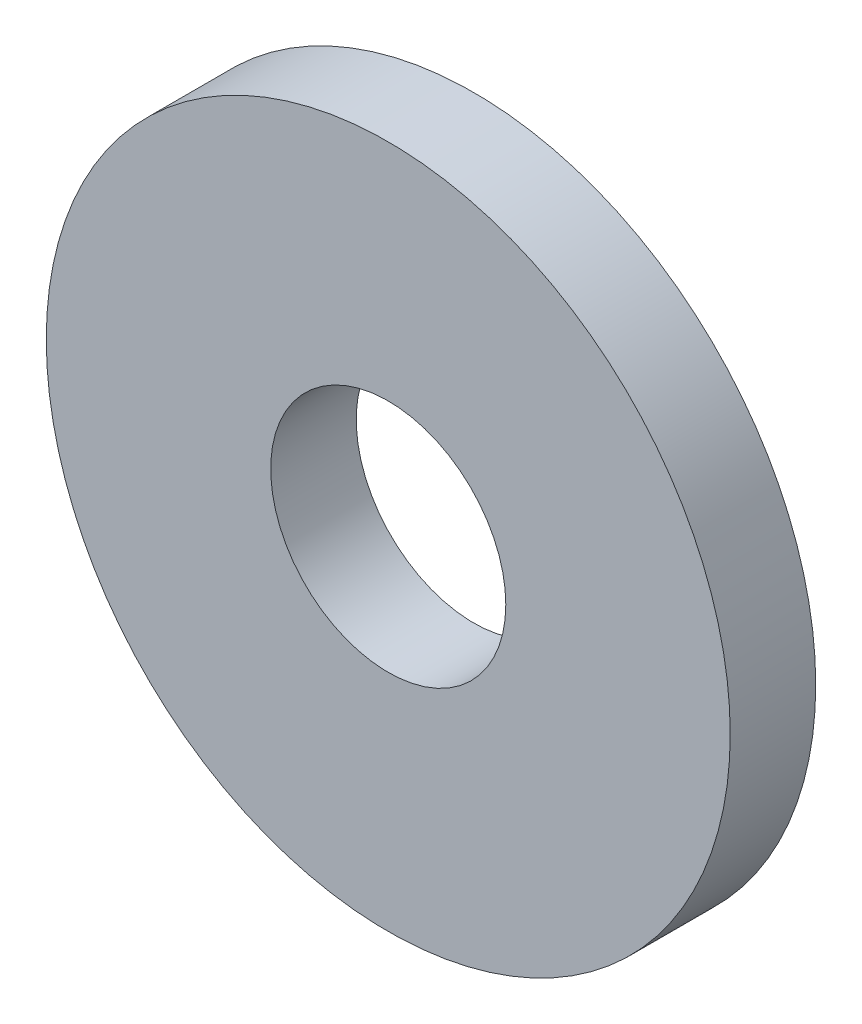
ISO-10303-21;
HEADER;
FILE_DESCRIPTION(('STEP AP214'),'2;1');
FILE_NAME('part.step','',(''),(''),'','','');
FILE_SCHEMA(('AUTOMOTIVE_DESIGN { 1 0 10303 214 1 1 1 1 }'));
ENDSEC;
DATA;
#1=APPLICATION_CONTEXT('core data for automotive mechanical design processes');
#2=APPLICATION_PROTOCOL_DEFINITION('international standard','automotive_design',2000,#1);
#3=PRODUCT_CONTEXT('',#1,'mechanical');
#4=PRODUCT('Part','Part','',(#3));
#5=PRODUCT_RELATED_PRODUCT_CATEGORY('part','',(#4));
#6=PRODUCT_DEFINITION_FORMATION('','',#4);
#7=PRODUCT_DEFINITION_CONTEXT('part definition',#1,'design');
#8=PRODUCT_DEFINITION('design','',#6,#7);
#9=PRODUCT_DEFINITION_SHAPE('','',#8);
#10=(LENGTH_UNIT() NAMED_UNIT(*) SI_UNIT(.MILLI.,.METRE.));
#11=(NAMED_UNIT(*) PLANE_ANGLE_UNIT() SI_UNIT($,.RADIAN.));
#12=(NAMED_UNIT(*) SI_UNIT($,.STERADIAN.) SOLID_ANGLE_UNIT());
#13=UNCERTAINTY_MEASURE_WITH_UNIT(LENGTH_MEASURE(1.E-05),#10,'distance_accuracy_value','');
#14=(GEOMETRIC_REPRESENTATION_CONTEXT(3) GLOBAL_UNCERTAINTY_ASSIGNED_CONTEXT((#13)) GLOBAL_UNIT_ASSIGNED_CONTEXT((#10,
#11,#12)) REPRESENTATION_CONTEXT('',''));
#15=CARTESIAN_POINT('',(0.,0.,0.));
#16=DIRECTION('',(0.,0.,1.));
#17=DIRECTION('',(1.,0.,0.));
#18=AXIS2_PLACEMENT_3D('',#15,#16,#17);
#19=CARTESIAN_POINT('',(0.,0.,0.4));
#20=DIRECTION('',(0.,0.,1.));
#21=DIRECTION('',(1.,0.,0.));
#22=AXIS2_PLACEMENT_3D('',#19,#20,#21);
#23=PLANE('',#22);
#24=CARTESIAN_POINT('',(0.,0.,0.4));
#25=DIRECTION('',(0.,0.,1.));
#26=DIRECTION('',(1.,0.,0.));
#27=AXIS2_PLACEMENT_3D('',#24,#25,#26);
#28=CIRCLE('',#27,1.6);
#29=CARTESIAN_POINT('',(1.6,0.,0.4));
#30=VERTEX_POINT('',#29);
#31=EDGE_CURVE('E10',#30,#30,#28,.T.);
#32=ORIENTED_EDGE('',*,*,#31,.T.);
#33=EDGE_LOOP('',(#32));
#34=FACE_BOUND('',#33,.T.);
#35=CARTESIAN_POINT('',(0.,0.,0.4));
#36=DIRECTION('',(0.,0.,1.));
#37=DIRECTION('',(1.,0.,0.));
#38=AXIS2_PLACEMENT_3D('',#35,#36,#37);
#39=CIRCLE('',#38,0.55);
#40=CARTESIAN_POINT('',(0.55,0.,0.4));
#41=VERTEX_POINT('',#40);
#42=EDGE_CURVE('E48',#41,#41,#39,.T.);
#43=ORIENTED_EDGE('',*,*,#42,.F.);
#44=EDGE_LOOP('',(#43));
#45=FACE_BOUND('',#44,.T.);
#46=ADVANCED_FACE('F37',(#34,#45),#23,.T.);
#47=CARTESIAN_POINT('',(0.,0.,0.));
#48=DIRECTION('',(0.,0.,1.));
#49=DIRECTION('',(1.,0.,0.));
#50=AXIS2_PLACEMENT_3D('',#47,#48,#49);
#51=PLANE('',#50);
#52=CARTESIAN_POINT('',(0.,0.,0.));
#53=DIRECTION('',(0.,0.,1.));
#54=DIRECTION('',(1.,0.,0.));
#55=AXIS2_PLACEMENT_3D('',#52,#53,#54);
#56=CIRCLE('',#55,1.6);
#57=CARTESIAN_POINT('',(1.6,0.,0.));
#58=VERTEX_POINT('',#57);
#59=EDGE_CURVE('E41',#58,#58,#56,.T.);
#60=ORIENTED_EDGE('',*,*,#59,.F.);
#61=EDGE_LOOP('',(#60));
#62=FACE_BOUND('',#61,.T.);
#63=CARTESIAN_POINT('',(0.,0.,0.));
#64=DIRECTION('',(0.,0.,1.));
#65=DIRECTION('',(1.,0.,0.));
#66=AXIS2_PLACEMENT_3D('',#63,#64,#65);
#67=CIRCLE('',#66,0.55);
#68=CARTESIAN_POINT('',(0.55,0.,0.));
#69=VERTEX_POINT('',#68);
#70=EDGE_CURVE('E50',#69,#69,#67,.T.);
#71=ORIENTED_EDGE('',*,*,#70,.T.);
#72=EDGE_LOOP('',(#71));
#73=FACE_BOUND('',#72,.T.);
#74=ADVANCED_FACE('F60',(#62,#73),#51,.F.);
#75=CARTESIAN_POINT('',(0.,0.,0.4));
#76=DIRECTION('',(0.,0.,-1.));
#77=DIRECTION('',(-1.,0.,0.));
#78=AXIS2_PLACEMENT_3D('',#75,#76,#77);
#79=CYLINDRICAL_SURFACE('',#78,1.6);
#80=ORIENTED_EDGE('',*,*,#31,.F.);
#81=EDGE_LOOP('',(#80));
#82=FACE_BOUND('',#81,.T.);
#83=ORIENTED_EDGE('',*,*,#59,.T.);
#84=EDGE_LOOP('',(#83));
#85=FACE_BOUND('',#84,.T.);
#86=ADVANCED_FACE('F39',(#82,#85),#79,.T.);
#87=CARTESIAN_POINT('',(0.,0.,0.4));
#88=DIRECTION('',(0.,0.,-1.));
#89=DIRECTION('',(-1.,0.,0.));
#90=AXIS2_PLACEMENT_3D('',#87,#88,#89);
#91=CYLINDRICAL_SURFACE('',#90,0.55);
#92=ORIENTED_EDGE('',*,*,#42,.T.);
#93=EDGE_LOOP('',(#92));
#94=FACE_BOUND('',#93,.T.);
#95=ORIENTED_EDGE('',*,*,#70,.F.);
#96=EDGE_LOOP('',(#95));
#97=FACE_BOUND('',#96,.T.);
#98=ADVANCED_FACE('F56',(#94,#97),#91,.F.);
#99=CLOSED_SHELL('',(#46,#74,#86,#98));
#100=MANIFOLD_SOLID_BREP('B2',#99);
#101=ADVANCED_BREP_SHAPE_REPRESENTATION('',(#18,#100),#14);
#102=SHAPE_DEFINITION_REPRESENTATION(#9,#101);
ENDSEC;
END-ISO-10303-21;
